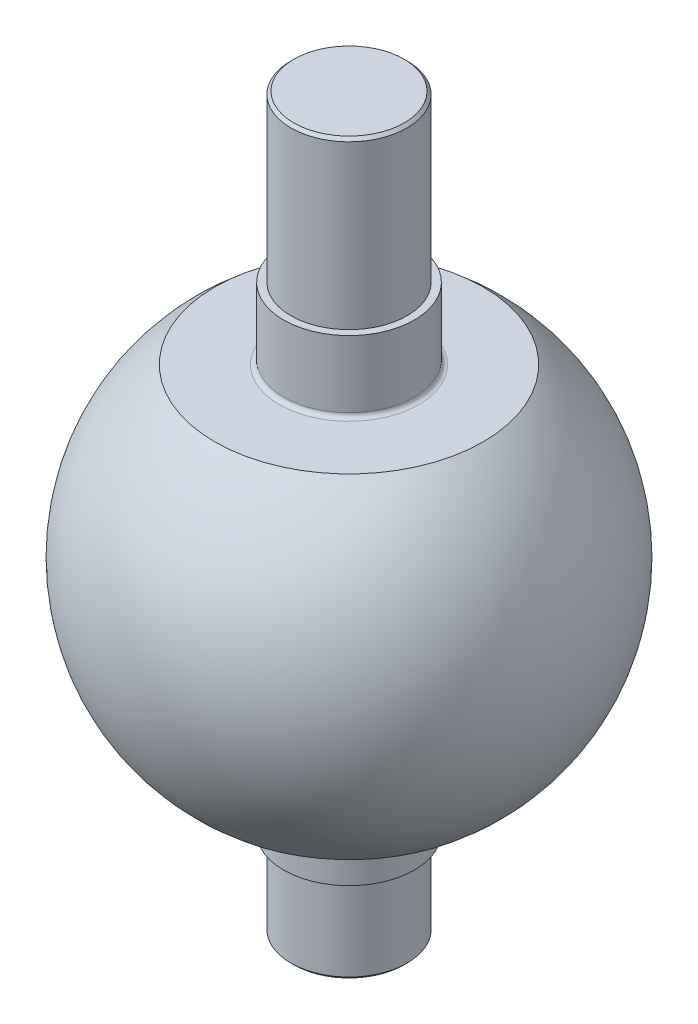
ISO-10303-21;
HEADER;
FILE_DESCRIPTION(('STEP AP214'),'2;1');
FILE_NAME('part.step','',(''),(''),'','','');
FILE_SCHEMA(('AUTOMOTIVE_DESIGN { 1 0 10303 214 1 1 1 1 }'));
ENDSEC;
DATA;
#1=APPLICATION_CONTEXT('core data for automotive mechanical design processes');
#2=APPLICATION_PROTOCOL_DEFINITION('international standard','automotive_design',2000,#1);
#3=PRODUCT_CONTEXT('',#1,'mechanical');
#4=PRODUCT('Part','Part','',(#3));
#5=PRODUCT_RELATED_PRODUCT_CATEGORY('part','',(#4));
#6=PRODUCT_DEFINITION_FORMATION('','',#4);
#7=PRODUCT_DEFINITION_CONTEXT('part definition',#1,'design');
#8=PRODUCT_DEFINITION('design','',#6,#7);
#9=PRODUCT_DEFINITION_SHAPE('','',#8);
#10=(LENGTH_UNIT() NAMED_UNIT(*) SI_UNIT(.MILLI.,.METRE.));
#11=(NAMED_UNIT(*) PLANE_ANGLE_UNIT() SI_UNIT($,.RADIAN.));
#12=(NAMED_UNIT(*) SI_UNIT($,.STERADIAN.) SOLID_ANGLE_UNIT());
#13=UNCERTAINTY_MEASURE_WITH_UNIT(LENGTH_MEASURE(1.E-05),#10,'distance_accuracy_value','');
#14=(GEOMETRIC_REPRESENTATION_CONTEXT(3) GLOBAL_UNCERTAINTY_ASSIGNED_CONTEXT((#13)) GLOBAL_UNIT_ASSIGNED_CONTEXT((#10,
#11,#12)) REPRESENTATION_CONTEXT('',''));
#15=CARTESIAN_POINT('',(0.,0.,0.));
#16=DIRECTION('',(0.,0.,1.));
#17=DIRECTION('',(1.,0.,0.));
#18=AXIS2_PLACEMENT_3D('',#15,#16,#17);
#19=CARTESIAN_POINT('',(0.,0.,0.));
#20=DIRECTION('',(0.,1.,0.));
#21=DIRECTION('',(-1.,0.,0.));
#22=AXIS2_PLACEMENT_3D('',#19,#20,#21);
#23=SPHERICAL_SURFACE('',#22,147.5);
#24=CARTESIAN_POINT('',(0.,-115.,0.));
#25=DIRECTION('',(0.,1.,0.));
#26=DIRECTION('',(0.,0.,1.));
#27=AXIS2_PLACEMENT_3D('',#24,#25,#26);
#28=CIRCLE('',#27,92.3647660095558);
#29=CARTESIAN_POINT('',(-92.3647660095558,-115.,0.));
#30=VERTEX_POINT('',#29);
#31=EDGE_CURVE('E11',#30,#30,#28,.T.);
#32=CARTESIAN_POINT('',(0.,115.,0.));
#33=DIRECTION('',(0.,1.,0.));
#34=DIRECTION('',(0.,0.,1.));
#35=AXIS2_PLACEMENT_3D('',#32,#33,#34);
#36=CIRCLE('',#35,92.3647660095558);
#37=CARTESIAN_POINT('',(-92.3647660095558,115.,0.));
#38=VERTEX_POINT('',#37);
#39=EDGE_CURVE('E81',#38,#38,#36,.T.);
#40=CARTESIAN_POINT('',(-92.3647660095558,-115.,0.));
#41=CARTESIAN_POINT('',(-93.4358558957262,-114.139737623354,0.));
#42=CARTESIAN_POINT('',(-94.4949204446251,-113.264503353867,0.));
#43=CARTESIAN_POINT('',(-96.5881873952788,-111.484792302969,0.));
#44=CARTESIAN_POINT('',(-97.6223897970335,-110.580315521559,0.));
#45=CARTESIAN_POINT('',(-99.6651209807978,-108.742820720578,0.));
#46=CARTESIAN_POINT('',(-100.673649762807,-107.809802701007,0.));
#47=CARTESIAN_POINT('',(-102.664247477772,-105.915955095707,0.));
#48=CARTESIAN_POINT('',(-103.646316410726,-104.955125509977,0.));
#49=CARTESIAN_POINT('',(-105.583227461173,-103.006404516989,0.));
#50=CARTESIAN_POINT('',(-106.538069578665,-102.018513109732,0.));
#51=CARTESIAN_POINT('',(-108.419781660333,-100.016439783853,0.));
#52=CARTESIAN_POINT('',(-109.346651624508,-99.0022578652318,0.));
#53=CARTESIAN_POINT('',(-111.171695798663,-96.9483952333325,0.));
#54=CARTESIAN_POINT('',(-112.069870008643,-95.9087145200541,0.));
#55=CARTESIAN_POINT('',(-113.836821502256,-93.8046659532258,0.));
#56=CARTESIAN_POINT('',(-114.70559878589,-92.7402980996758,0.));
#57=CARTESIAN_POINT('',(-116.413078196782,-90.5877061707553,0.));
#58=CARTESIAN_POINT('',(-117.251780324039,-89.4994820953847,0.));
#59=CARTESIAN_POINT('',(-118.89845467285,-87.3000272673785,0.));
#60=CARTESIAN_POINT('',(-119.706426894403,-86.1887965147429,0.));
#61=CARTESIAN_POINT('',(-121.291010671882,-83.9441958367825,0.));
#62=CARTESIAN_POINT('',(-122.067622227808,-82.8108259114577,0.));
#63=CARTESIAN_POINT('',(-123.588878396584,-80.522831676249,0.));
#64=CARTESIAN_POINT('',(-124.333523009433,-79.3682073663651,0.));
#65=CARTESIAN_POINT('',(-125.79026397021,-77.0386057427887,0.));
#66=CARTESIAN_POINT('',(-126.502360318138,-75.8636284290962,0.));
#67=CARTESIAN_POINT('',(-127.893448836692,-73.494238067648,0.));
#68=CARTESIAN_POINT('',(-128.57244100732,-72.2998250198923,0.));
#69=CARTESIAN_POINT('',(-129.89679110234,-69.8924956329577,0.));
#70=CARTESIAN_POINT('',(-130.542149026732,-68.6795792937787,0.));
#71=CARTESIAN_POINT('',(-131.798726817598,-66.2361902116062,0.));
#72=CARTESIAN_POINT('',(-132.409946684072,-65.0057174686127,0.));
#73=CARTESIAN_POINT('',(-133.597771197983,-62.52817617218,0.));
#74=CARTESIAN_POINT('',(-134.17437584542,-61.281107618741,0.));
#75=CARTESIAN_POINT('',(-135.292519783208,-58.7713482506408,0.));
#76=CARTESIAN_POINT('',(-135.834059073558,-57.5086574359797,0.));
#77=CARTESIAN_POINT('',(-136.881649533601,-54.9686392904923,0.));
#78=CARTESIAN_POINT('',(-137.387700703293,-53.691311959666,0.));
#79=CARTESIAN_POINT('',(-138.363919862965,-51.1230179531964,0.));
#80=CARTESIAN_POINT('',(-138.834087852945,-49.8320512775532,0.));
#81=CARTESIAN_POINT('',(-139.738173607065,-47.237486400628,0.));
#82=CARTESIAN_POINT('',(-140.172091371206,-45.933888199346,0.));
#83=CARTESIAN_POINT('',(-141.003337926994,-43.3150779513767,0.));
#84=CARTESIAN_POINT('',(-141.40066671864,-41.9998659046893,0.));
#85=CARTESIAN_POINT('',(-142.158425146702,-39.3588547127253,0.));
#86=CARTESIAN_POINT('',(-142.518854783117,-38.0330555674486,0.));
#87=CARTESIAN_POINT('',(-143.20253352405,-35.3719051901542,0.));
#88=CARTESIAN_POINT('',(-143.525782628567,-34.0365539581364,0.));
#89=CARTESIAN_POINT('',(-144.13484795477,-31.3573418762371,0.));
#90=CARTESIAN_POINT('',(-144.420664176455,-30.0134810263555,0.));
#91=CARTESIAN_POINT('',(-144.954640608794,-27.318298820811,0.));
#92=CARTESIAN_POINT('',(-145.202800819448,-25.9669774651479,0.));
#93=CARTESIAN_POINT('',(-145.66127149845,-23.2579291843169,0.));
#94=CARTESIAN_POINT('',(-145.871581966798,-21.900202259149,0.));
#95=CARTESIAN_POINT('',(-146.254188978078,-19.1794027762217,0.));
#96=CARTESIAN_POINT('',(-146.42648552101,-17.8163302184625,0.));
#97=CARTESIAN_POINT('',(-146.732930174687,-15.0859035804422,0.));
#98=CARTESIAN_POINT('',(-146.867078285431,-13.7185495001812,0.));
#99=CARTESIAN_POINT('',(-147.097121349303,-10.9806272697038,0.));
#100=CARTESIAN_POINT('',(-147.193016302431,-9.61005911948752,0.));
#101=CARTESIAN_POINT('',(-147.346478188741,-6.86677871077462,0.));
#102=CARTESIAN_POINT('',(-147.404045121923,-5.49406645227803,0.));
#103=CARTESIAN_POINT('',(-147.480806027552,-2.74756946252096,0.));
#104=CARTESIAN_POINT('',(-147.5,-1.37378473126048,0.));
#105=CARTESIAN_POINT('',(-147.5,1.37378473126048,0.));
#106=CARTESIAN_POINT('',(-147.480806027552,2.74756946252096,0.));
#107=CARTESIAN_POINT('',(-147.404045121923,5.49406645227803,0.));
#108=CARTESIAN_POINT('',(-147.346478188741,6.86677871077462,0.));
#109=CARTESIAN_POINT('',(-147.193016302431,9.61005911948752,0.));
#110=CARTESIAN_POINT('',(-147.097121349303,10.9806272697038,0.));
#111=CARTESIAN_POINT('',(-146.867078285431,13.7185495001812,0.));
#112=CARTESIAN_POINT('',(-146.732930174687,15.0859035804422,0.));
#113=CARTESIAN_POINT('',(-146.42648552101,17.8163302184625,0.));
#114=CARTESIAN_POINT('',(-146.254188978078,19.1794027762217,0.));
#115=CARTESIAN_POINT('',(-145.871581966798,21.900202259149,0.));
#116=CARTESIAN_POINT('',(-145.66127149845,23.2579291843169,0.));
#117=CARTESIAN_POINT('',(-145.202800819448,25.9669774651479,0.));
#118=CARTESIAN_POINT('',(-144.954640608794,27.318298820811,0.));
#119=CARTESIAN_POINT('',(-144.420664176455,30.0134810263555,0.));
#120=CARTESIAN_POINT('',(-144.13484795477,31.3573418762371,0.));
#121=CARTESIAN_POINT('',(-143.525782628567,34.0365539581364,0.));
#122=CARTESIAN_POINT('',(-143.20253352405,35.3719051901542,0.));
#123=CARTESIAN_POINT('',(-142.518854783117,38.0330555674486,0.));
#124=CARTESIAN_POINT('',(-142.158425146702,39.3588547127253,0.));
#125=CARTESIAN_POINT('',(-141.40066671864,41.9998659046893,0.));
#126=CARTESIAN_POINT('',(-141.003337926994,43.3150779513767,0.));
#127=CARTESIAN_POINT('',(-140.172091371206,45.933888199346,0.));
#128=CARTESIAN_POINT('',(-139.738173607065,47.237486400628,0.));
#129=CARTESIAN_POINT('',(-138.834087852945,49.8320512775532,0.));
#130=CARTESIAN_POINT('',(-138.363919862965,51.1230179531964,0.));
#131=CARTESIAN_POINT('',(-137.387700703293,53.691311959666,0.));
#132=CARTESIAN_POINT('',(-136.881649533601,54.9686392904923,0.));
#133=CARTESIAN_POINT('',(-135.834059073558,57.5086574359798,0.));
#134=CARTESIAN_POINT('',(-135.292519783208,58.7713482506408,0.));
#135=CARTESIAN_POINT('',(-134.17437584542,61.281107618741,0.));
#136=CARTESIAN_POINT('',(-133.597771197983,62.52817617218,0.));
#137=CARTESIAN_POINT('',(-132.409946684072,65.0057174686127,0.));
#138=CARTESIAN_POINT('',(-131.798726817598,66.2361902116062,0.));
#139=CARTESIAN_POINT('',(-130.542149026732,68.6795792937787,0.));
#140=CARTESIAN_POINT('',(-129.89679110234,69.8924956329577,0.));
#141=CARTESIAN_POINT('',(-128.57244100732,72.2998250198923,0.));
#142=CARTESIAN_POINT('',(-127.893448836692,73.494238067648,0.));
#143=CARTESIAN_POINT('',(-126.502360318138,75.8636284290962,0.));
#144=CARTESIAN_POINT('',(-125.79026397021,77.0386057427887,0.));
#145=CARTESIAN_POINT('',(-124.333523009433,79.3682073663651,0.));
#146=CARTESIAN_POINT('',(-123.588878396584,80.522831676249,0.));
#147=CARTESIAN_POINT('',(-122.067622227808,82.8108259114577,0.));
#148=CARTESIAN_POINT('',(-121.291010671882,83.9441958367825,0.));
#149=CARTESIAN_POINT('',(-119.706426894403,86.1887965147429,0.));
#150=CARTESIAN_POINT('',(-118.89845467285,87.3000272673785,0.));
#151=CARTESIAN_POINT('',(-117.251780324039,89.4994820953847,0.));
#152=CARTESIAN_POINT('',(-116.413078196782,90.5877061707553,0.));
#153=CARTESIAN_POINT('',(-114.70559878589,92.7402980996758,0.));
#154=CARTESIAN_POINT('',(-113.836821502256,93.8046659532258,0.));
#155=CARTESIAN_POINT('',(-112.069870008643,95.9087145200541,0.));
#156=CARTESIAN_POINT('',(-111.171695798663,96.9483952333325,0.));
#157=CARTESIAN_POINT('',(-109.346651624508,99.0022578652318,0.));
#158=CARTESIAN_POINT('',(-108.419781660333,100.016439783853,0.));
#159=CARTESIAN_POINT('',(-106.538069578665,102.018513109732,0.));
#160=CARTESIAN_POINT('',(-105.583227461173,103.00640451699,0.));
#161=CARTESIAN_POINT('',(-103.646316410726,104.955125509977,0.));
#162=CARTESIAN_POINT('',(-102.664247477772,105.915955095707,0.));
#163=CARTESIAN_POINT('',(-100.673649762807,107.809802701007,0.));
#164=CARTESIAN_POINT('',(-99.6651209807978,108.742820720578,0.));
#165=CARTESIAN_POINT('',(-97.6223897970335,110.580315521559,0.));
#166=CARTESIAN_POINT('',(-96.5881873952788,111.484792302969,0.));
#167=CARTESIAN_POINT('',(-94.4949204446251,113.264503353867,0.));
#168=CARTESIAN_POINT('',(-93.4358558957262,114.139737623354,0.));
#169=CARTESIAN_POINT('',(-92.3647660095558,115.,0.));
#170=B_SPLINE_CURVE_WITH_KNOTS('',3,(#40,#41,#42,#43,#44,#45,#46,#47,#48,#49,#50,#51,#52,#53,
#54,#55,#56,#57,#58,#59,#60,#61,#62,#63,#64,#65,#66,#67,#68,#69,#70,#71,#72,#73,#74,#75,#76,#77,
#78,#79,#80,#81,#82,#83,#84,#85,#86,#87,#88,#89,#90,#91,#92,#93,#94,#95,#96,#97,#98,#99,#100,
#101,#102,#103,#104,#105,#106,#107,#108,#109,#110,#111,#112,#113,#114,#115,#116,#117,#118,#119,
#120,#121,#122,#123,#124,#125,#126,#127,#128,#129,#130,#131,#132,#133,#134,#135,#136,#137,#138,
#139,#140,#141,#142,#143,#144,#145,#146,#147,#148,#149,#150,#151,#152,#153,#154,#155,#156,#157,
#158,#159,#160,#161,#162,#163,#164,#165,#166,#167,#168,#169),.UNSPECIFIED.,.F.,.F.,(4,2,2,2,2,2,
2,2,2,2,2,2,2,2,2,2,2,2,2,2,2,2,2,2,2,2,2,2,2,2,2,2,2,2,2,2,2,2,2,2,2,2,2,2,2,2,2,2,2,2,2,2,2,2,
2,2,2,2,2,2,2,2,2,2,4),(0.,4.12122014122888,8.24244028245772,12.3636604236866,16.4848805649155,
20.6061007061443,24.7273208473732,28.8485409886021,32.9697611298309,37.0909812710598,
41.2122014122887,45.3334215535175,49.4546416947464,53.5758618359753,57.6970819772041,
61.818302118433,65.9395222596619,70.0607424008907,74.1819625421196,78.3031826833485,
82.4244028245773,86.5456229658062,90.666843107035,94.7880632482639,98.9092833894928,
103.030503530722,107.151723671951,111.272943813179,115.394163954408,119.515384095637,
123.636604236866,127.757824378095,131.879044519324,136.000264660553,140.121484801781,
144.24270494301,148.363925084239,152.485145225468,156.606365366697,160.727585507926,
164.848805649155,168.970025790383,173.091245931612,177.212466072841,181.33368621407,
185.454906355299,189.576126496528,193.697346637757,197.818566778986,201.939786920214,
206.061007061443,210.182227202672,214.303447343901,218.42466748513,222.545887626359,
226.667107767588,230.788327908816,234.909548050045,239.030768191274,243.151988332503,
247.273208473732,251.394428614961,255.51564875619,259.636868897418,263.758089038647),.UNSPECIFIED.);
#171=EDGE_CURVE('BSEAM35',#30,#38,#170,.T.);
#172=ORIENTED_EDGE('',*,*,#31,.T.);
#173=ORIENTED_EDGE('',*,*,#39,.F.);
#174=ORIENTED_EDGE('',*,*,#171,.T.);
#175=ORIENTED_EDGE('',*,*,#171,.F.);
#176=EDGE_LOOP('',(#172,#174,#173,#175));
#177=FACE_BOUND('',#176,.T.);
#178=ADVANCED_FACE('F35',(#177),#23,.T.);
#179=CARTESIAN_POINT('',(-47.9999999999999,-115.,0.));
#180=DIRECTION('',(0.,-1.,0.));
#181=DIRECTION('',(0.,0.,-1.));
#182=AXIS2_PLACEMENT_3D('',#179,#180,#181);
#183=PLANE('',#182);
#184=CARTESIAN_POINT('',(0.,-115.,0.));
#185=DIRECTION('',(0.,1.,0.));
#186=DIRECTION('',(0.,0.,1.));
#187=AXIS2_PLACEMENT_3D('',#184,#185,#186);
#188=CIRCLE('',#187,47.9999999999999);
#189=CARTESIAN_POINT('',(0.,-115.,47.9999999999999));
#190=VERTEX_POINT('',#189);
#191=EDGE_CURVE('E41',#190,#190,#188,.T.);
#192=ORIENTED_EDGE('',*,*,#191,.T.);
#193=EDGE_LOOP('',(#192));
#194=FACE_BOUND('',#193,.T.);
#195=ORIENTED_EDGE('',*,*,#31,.F.);
#196=EDGE_LOOP('',(#195));
#197=FACE_BOUND('',#196,.T.);
#198=ADVANCED_FACE('F89',(#194,#197),#183,.T.);
#199=CARTESIAN_POINT('',(0.,-118.,0.));
#200=DIRECTION('',(0.,1.,0.));
#201=DIRECTION('',(0.,0.,1.));
#202=AXIS2_PLACEMENT_3D('',#199,#200,#201);
#203=TOROIDAL_SURFACE('',#202,47.9999999999999,3.);
#204=CARTESIAN_POINT('',(0.,-118.,0.));
#205=DIRECTION('',(0.,1.,0.));
#206=DIRECTION('',(0.,0.,1.));
#207=AXIS2_PLACEMENT_3D('',#204,#205,#206);
#208=CIRCLE('',#207,44.9999999999999);
#209=CARTESIAN_POINT('',(0.,-118.,44.9999999999999));
#210=VERTEX_POINT('',#209);
#211=EDGE_CURVE('E45',#210,#210,#208,.T.);
#212=ORIENTED_EDGE('',*,*,#211,.T.);
#213=EDGE_LOOP('',(#212));
#214=FACE_BOUND('',#213,.T.);
#215=ORIENTED_EDGE('',*,*,#191,.F.);
#216=EDGE_LOOP('',(#215));
#217=FACE_BOUND('',#216,.T.);
#218=ADVANCED_FACE('F93',(#214,#217),#203,.F.);
#219=CARTESIAN_POINT('',(0.,332.38327699485,0.));
#220=DIRECTION('',(0.,1.,0.));
#221=DIRECTION('',(0.,0.,1.));
#222=AXIS2_PLACEMENT_3D('',#219,#220,#221);
#223=CYLINDRICAL_SURFACE('',#222,44.9999999999999);
#224=CARTESIAN_POINT('',(0.,-164.,0.));
#225=DIRECTION('',(0.,1.,0.));
#226=DIRECTION('',(0.,0.,1.));
#227=AXIS2_PLACEMENT_3D('',#224,#225,#226);
#228=CIRCLE('',#227,44.9999999999999);
#229=CARTESIAN_POINT('',(0.,-164.,44.9999999999999));
#230=VERTEX_POINT('',#229);
#231=EDGE_CURVE('E49',#230,#230,#228,.T.);
#232=ORIENTED_EDGE('',*,*,#231,.T.);
#233=EDGE_LOOP('',(#232));
#234=FACE_BOUND('',#233,.T.);
#235=ORIENTED_EDGE('',*,*,#211,.F.);
#236=EDGE_LOOP('',(#235));
#237=FACE_BOUND('',#236,.T.);
#238=ADVANCED_FACE('F97',(#234,#237),#223,.T.);
#239=CARTESIAN_POINT('',(-39.9999999999999,-164.,0.));
#240=DIRECTION('',(0.,-1.,0.));
#241=DIRECTION('',(0.,0.,-1.));
#242=AXIS2_PLACEMENT_3D('',#239,#240,#241);
#243=PLANE('',#242);
#244=CARTESIAN_POINT('',(0.,-164.,0.));
#245=DIRECTION('',(0.,1.,0.));
#246=DIRECTION('',(0.,0.,1.));
#247=AXIS2_PLACEMENT_3D('',#244,#245,#246);
#248=CIRCLE('',#247,39.9999999999999);
#249=CARTESIAN_POINT('',(0.,-164.,39.9999999999999));
#250=VERTEX_POINT('',#249);
#251=EDGE_CURVE('E54',#250,#250,#248,.T.);
#252=ORIENTED_EDGE('',*,*,#251,.T.);
#253=EDGE_LOOP('',(#252));
#254=FACE_BOUND('',#253,.T.);
#255=ORIENTED_EDGE('',*,*,#231,.F.);
#256=EDGE_LOOP('',(#255));
#257=FACE_BOUND('',#256,.T.);
#258=ADVANCED_FACE('F104',(#254,#257),#243,.T.);
#259=CARTESIAN_POINT('',(0.,332.38327699485,0.));
#260=DIRECTION('',(0.,1.,0.));
#261=DIRECTION('',(0.,0.,1.));
#262=AXIS2_PLACEMENT_3D('',#259,#260,#261);
#263=CYLINDRICAL_SURFACE('',#262,39.9999999999999);
#264=CARTESIAN_POINT('',(0.,-222.,0.));
#265=DIRECTION('',(0.,1.,0.));
#266=DIRECTION('',(0.,0.,1.));
#267=AXIS2_PLACEMENT_3D('',#264,#265,#266);
#268=CIRCLE('',#267,39.9999999999999);
#269=CARTESIAN_POINT('',(0.,-222.,39.9999999999999));
#270=VERTEX_POINT('',#269);
#271=EDGE_CURVE('E57',#270,#270,#268,.T.);
#272=ORIENTED_EDGE('',*,*,#271,.T.);
#273=EDGE_LOOP('',(#272));
#274=FACE_BOUND('',#273,.T.);
#275=ORIENTED_EDGE('',*,*,#251,.F.);
#276=EDGE_LOOP('',(#275));
#277=FACE_BOUND('',#276,.T.);
#278=ADVANCED_FACE('F108',(#274,#277),#263,.T.);
#279=CARTESIAN_POINT('',(0.,-222.,0.));
#280=DIRECTION('',(0.,1.,0.));
#281=DIRECTION('',(0.,0.,1.));
#282=AXIS2_PLACEMENT_3D('',#279,#280,#281);
#283=CONICAL_SURFACE('',#282,39.9999999999999,0.78539816339745);
#284=CARTESIAN_POINT('',(0.,-224.,0.));
#285=DIRECTION('',(0.,1.,0.));
#286=DIRECTION('',(0.,0.,1.));
#287=AXIS2_PLACEMENT_3D('',#284,#285,#286);
#288=CIRCLE('',#287,37.9999999999999);
#289=CARTESIAN_POINT('',(0.,-224.,37.9999999999999));
#290=VERTEX_POINT('',#289);
#291=EDGE_CURVE('E60',#290,#290,#288,.T.);
#292=ORIENTED_EDGE('',*,*,#291,.T.);
#293=EDGE_LOOP('',(#292));
#294=FACE_BOUND('',#293,.T.);
#295=ORIENTED_EDGE('',*,*,#271,.F.);
#296=EDGE_LOOP('',(#295));
#297=FACE_BOUND('',#296,.T.);
#298=ADVANCED_FACE('F112',(#294,#297),#283,.T.);
#299=CARTESIAN_POINT('',(0.,-224.,0.));
#300=DIRECTION('',(0.,-1.,0.));
#301=DIRECTION('',(0.,0.,-1.));
#302=AXIS2_PLACEMENT_3D('',#299,#300,#301);
#303=PLANE('',#302);
#304=ORIENTED_EDGE('',*,*,#291,.F.);
#305=EDGE_LOOP('',(#304));
#306=FACE_BOUND('',#305,.T.);
#307=ADVANCED_FACE('F116',(#306),#303,.T.);
#308=CARTESIAN_POINT('',(-38.,278.,0.));
#309=DIRECTION('',(0.,1.,0.));
#310=DIRECTION('',(0.,0.,1.));
#311=AXIS2_PLACEMENT_3D('',#308,#309,#310);
#312=PLANE('',#311);
#313=CARTESIAN_POINT('',(0.,278.,0.));
#314=DIRECTION('',(0.,1.,0.));
#315=DIRECTION('',(0.,0.,1.));
#316=AXIS2_PLACEMENT_3D('',#313,#314,#315);
#317=CIRCLE('',#316,38.);
#318=CARTESIAN_POINT('',(0.,278.,38.));
#319=VERTEX_POINT('',#318);
#320=EDGE_CURVE('E63',#319,#319,#317,.T.);
#321=ORIENTED_EDGE('',*,*,#320,.T.);
#322=EDGE_LOOP('',(#321));
#323=FACE_BOUND('',#322,.T.);
#324=ADVANCED_FACE('F120',(#323),#312,.T.);
#325=CARTESIAN_POINT('',(0.,278.,0.));
#326=DIRECTION('',(0.,-1.,0.));
#327=DIRECTION('',(0.,0.,-1.));
#328=AXIS2_PLACEMENT_3D('',#325,#326,#327);
#329=CONICAL_SURFACE('',#328,38.,0.785398163397443);
#330=CARTESIAN_POINT('',(0.,276.,0.));
#331=DIRECTION('',(0.,1.,0.));
#332=DIRECTION('',(0.,0.,1.));
#333=AXIS2_PLACEMENT_3D('',#330,#331,#332);
#334=CIRCLE('',#333,40.);
#335=CARTESIAN_POINT('',(0.,276.,40.));
#336=VERTEX_POINT('',#335);
#337=EDGE_CURVE('E66',#336,#336,#334,.T.);
#338=ORIENTED_EDGE('',*,*,#337,.T.);
#339=EDGE_LOOP('',(#338));
#340=FACE_BOUND('',#339,.T.);
#341=ORIENTED_EDGE('',*,*,#320,.F.);
#342=EDGE_LOOP('',(#341));
#343=FACE_BOUND('',#342,.T.);
#344=ADVANCED_FACE('F124',(#340,#343),#329,.T.);
#345=CARTESIAN_POINT('',(0.,332.38327699485,0.));
#346=DIRECTION('',(0.,1.,0.));
#347=DIRECTION('',(0.,0.,1.));
#348=AXIS2_PLACEMENT_3D('',#345,#346,#347);
#349=CYLINDRICAL_SURFACE('',#348,40.);
#350=CARTESIAN_POINT('',(0.,164.,0.));
#351=DIRECTION('',(0.,1.,0.));
#352=DIRECTION('',(0.,0.,1.));
#353=AXIS2_PLACEMENT_3D('',#350,#351,#352);
#354=CIRCLE('',#353,40.);
#355=CARTESIAN_POINT('',(0.,164.,40.));
#356=VERTEX_POINT('',#355);
#357=EDGE_CURVE('E69',#356,#356,#354,.T.);
#358=ORIENTED_EDGE('',*,*,#357,.T.);
#359=EDGE_LOOP('',(#358));
#360=FACE_BOUND('',#359,.T.);
#361=ORIENTED_EDGE('',*,*,#337,.F.);
#362=EDGE_LOOP('',(#361));
#363=FACE_BOUND('',#362,.T.);
#364=ADVANCED_FACE('F128',(#360,#363),#349,.T.);
#365=CARTESIAN_POINT('',(-45.,164.,0.));
#366=DIRECTION('',(0.,1.,0.));
#367=DIRECTION('',(0.,0.,1.));
#368=AXIS2_PLACEMENT_3D('',#365,#366,#367);
#369=PLANE('',#368);
#370=CARTESIAN_POINT('',(0.,164.,0.));
#371=DIRECTION('',(0.,1.,0.));
#372=DIRECTION('',(0.,0.,1.));
#373=AXIS2_PLACEMENT_3D('',#370,#371,#372);
#374=CIRCLE('',#373,45.);
#375=CARTESIAN_POINT('',(0.,164.,45.));
#376=VERTEX_POINT('',#375);
#377=EDGE_CURVE('E72',#376,#376,#374,.T.);
#378=ORIENTED_EDGE('',*,*,#377,.T.);
#379=EDGE_LOOP('',(#378));
#380=FACE_BOUND('',#379,.T.);
#381=ORIENTED_EDGE('',*,*,#357,.F.);
#382=EDGE_LOOP('',(#381));
#383=FACE_BOUND('',#382,.T.);
#384=ADVANCED_FACE('F132',(#380,#383),#369,.T.);
#385=CARTESIAN_POINT('',(0.,332.38327699485,0.));
#386=DIRECTION('',(0.,1.,0.));
#387=DIRECTION('',(0.,0.,1.));
#388=AXIS2_PLACEMENT_3D('',#385,#386,#387);
#389=CYLINDRICAL_SURFACE('',#388,45.);
#390=CARTESIAN_POINT('',(0.,118.,0.));
#391=DIRECTION('',(0.,1.,0.));
#392=DIRECTION('',(0.,0.,1.));
#393=AXIS2_PLACEMENT_3D('',#390,#391,#392);
#394=CIRCLE('',#393,45.);
#395=CARTESIAN_POINT('',(0.,118.,45.));
#396=VERTEX_POINT('',#395);
#397=EDGE_CURVE('E75',#396,#396,#394,.T.);
#398=ORIENTED_EDGE('',*,*,#397,.T.);
#399=EDGE_LOOP('',(#398));
#400=FACE_BOUND('',#399,.T.);
#401=ORIENTED_EDGE('',*,*,#377,.F.);
#402=EDGE_LOOP('',(#401));
#403=FACE_BOUND('',#402,.T.);
#404=ADVANCED_FACE('F136',(#400,#403),#389,.T.);
#405=CARTESIAN_POINT('',(0.,118.,0.));
#406=DIRECTION('',(0.,1.,0.));
#407=DIRECTION('',(0.,0.,1.));
#408=AXIS2_PLACEMENT_3D('',#405,#406,#407);
#409=TOROIDAL_SURFACE('',#408,48.,3.);
#410=CARTESIAN_POINT('',(0.,115.,0.));
#411=DIRECTION('',(0.,1.,0.));
#412=DIRECTION('',(0.,0.,1.));
#413=AXIS2_PLACEMENT_3D('',#410,#411,#412);
#414=CIRCLE('',#413,48.);
#415=CARTESIAN_POINT('',(0.,115.,48.));
#416=VERTEX_POINT('',#415);
#417=EDGE_CURVE('E78',#416,#416,#414,.T.);
#418=ORIENTED_EDGE('',*,*,#417,.T.);
#419=EDGE_LOOP('',(#418));
#420=FACE_BOUND('',#419,.T.);
#421=ORIENTED_EDGE('',*,*,#397,.F.);
#422=EDGE_LOOP('',(#421));
#423=FACE_BOUND('',#422,.T.);
#424=ADVANCED_FACE('F140',(#420,#423),#409,.F.);
#425=CARTESIAN_POINT('',(-92.3647660095558,115.,0.));
#426=DIRECTION('',(0.,1.,0.));
#427=DIRECTION('',(0.,0.,1.));
#428=AXIS2_PLACEMENT_3D('',#425,#426,#427);
#429=PLANE('',#428);
#430=ORIENTED_EDGE('',*,*,#39,.T.);
#431=EDGE_LOOP('',(#430));
#432=FACE_BOUND('',#431,.T.);
#433=ORIENTED_EDGE('',*,*,#417,.F.);
#434=EDGE_LOOP('',(#433));
#435=FACE_BOUND('',#434,.T.);
#436=ADVANCED_FACE('F85',(#432,#435),#429,.T.);
#437=CLOSED_SHELL('',(#178,#198,#218,#238,#258,#278,#298,#307,#324,#344,#364,#384,#404,#424,#436));
#438=MANIFOLD_SOLID_BREP('B2',#437);
#439=ADVANCED_BREP_SHAPE_REPRESENTATION('',(#18,#438),#14);
#440=SHAPE_DEFINITION_REPRESENTATION(#9,#439);
ENDSEC;
END-ISO-10303-21;
